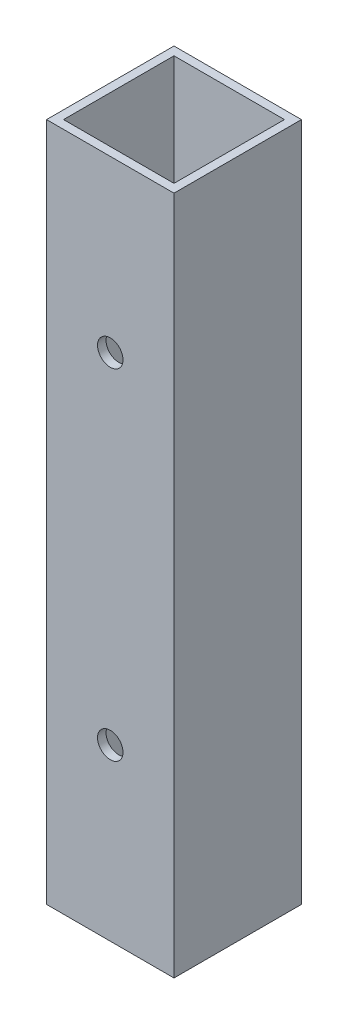
ISO-10303-21;
HEADER;
FILE_DESCRIPTION(('STEP AP214'),'2;1');
FILE_NAME('part.step','',(''),(''),'','','');
FILE_SCHEMA(('AUTOMOTIVE_DESIGN { 1 0 10303 214 1 1 1 1 }'));
ENDSEC;
DATA;
#1=APPLICATION_CONTEXT('core data for automotive mechanical design processes');
#2=APPLICATION_PROTOCOL_DEFINITION('international standard','automotive_design',2000,#1);
#3=PRODUCT_CONTEXT('',#1,'mechanical');
#4=PRODUCT('Part','Part','',(#3));
#5=PRODUCT_RELATED_PRODUCT_CATEGORY('part','',(#4));
#6=PRODUCT_DEFINITION_FORMATION('','',#4);
#7=PRODUCT_DEFINITION_CONTEXT('part definition',#1,'design');
#8=PRODUCT_DEFINITION('design','',#6,#7);
#9=PRODUCT_DEFINITION_SHAPE('','',#8);
#10=(LENGTH_UNIT() NAMED_UNIT(*) SI_UNIT(.MILLI.,.METRE.));
#11=(NAMED_UNIT(*) PLANE_ANGLE_UNIT() SI_UNIT($,.RADIAN.));
#12=(NAMED_UNIT(*) SI_UNIT($,.STERADIAN.) SOLID_ANGLE_UNIT());
#13=UNCERTAINTY_MEASURE_WITH_UNIT(LENGTH_MEASURE(1.E-05),#10,'distance_accuracy_value','');
#14=(GEOMETRIC_REPRESENTATION_CONTEXT(3) GLOBAL_UNCERTAINTY_ASSIGNED_CONTEXT((#13)) GLOBAL_UNIT_ASSIGNED_CONTEXT((#10,
#11,#12)) REPRESENTATION_CONTEXT('',''));
#15=CARTESIAN_POINT('',(0.,0.,0.));
#16=DIRECTION('',(0.,0.,1.));
#17=DIRECTION('',(1.,0.,0.));
#18=AXIS2_PLACEMENT_3D('',#15,#16,#17);
#19=CARTESIAN_POINT('',(0.,80.,0.));
#20=DIRECTION('',(0.,-1.,0.));
#21=DIRECTION('',(0.,0.,-1.));
#22=AXIS2_PLACEMENT_3D('',#19,#20,#21);
#23=PLANE('',#22);
#24=DIRECTION('',(0.,0.,-1.));
#25=VECTOR('',#24,1.);
#26=CARTESIAN_POINT('',(7.5,80.,7.5));
#27=LINE('',#26,#25);
#28=CARTESIAN_POINT('',(7.5,80.,7.5));
#29=VERTEX_POINT('',#28);
#30=CARTESIAN_POINT('',(7.5,80.,-7.5));
#31=VERTEX_POINT('',#30);
#32=EDGE_CURVE('E140',#29,#31,#27,.T.);
#33=ORIENTED_EDGE('',*,*,#32,.T.);
#34=DIRECTION('',(-1.,0.,0.));
#35=VECTOR('',#34,1.);
#36=CARTESIAN_POINT('',(-7.5,80.,-7.5));
#37=LINE('',#36,#35);
#38=CARTESIAN_POINT('',(-7.5,80.,-7.5));
#39=VERTEX_POINT('',#38);
#40=EDGE_CURVE('E143',#31,#39,#37,.T.);
#41=ORIENTED_EDGE('',*,*,#40,.T.);
#42=DIRECTION('',(0.,0.,1.));
#43=VECTOR('',#42,1.);
#44=CARTESIAN_POINT('',(-7.5,80.,7.5));
#45=LINE('',#44,#43);
#46=CARTESIAN_POINT('',(-7.5,80.,7.5));
#47=VERTEX_POINT('',#46);
#48=EDGE_CURVE('E146',#39,#47,#45,.T.);
#49=ORIENTED_EDGE('',*,*,#48,.T.);
#50=DIRECTION('',(1.,0.,0.));
#51=VECTOR('',#50,1.);
#52=CARTESIAN_POINT('',(-7.5,80.,7.5));
#53=LINE('',#52,#51);
#54=EDGE_CURVE('E148',#47,#29,#53,.T.);
#55=ORIENTED_EDGE('',*,*,#54,.T.);
#56=EDGE_LOOP('',(#33,#41,#49,#55));
#57=FACE_BOUND('',#56,.T.);
#58=DIRECTION('',(0.,0.,1.));
#59=VECTOR('',#58,1.);
#60=CARTESIAN_POINT('',(-6.5,80.,6.5));
#61=LINE('',#60,#59);
#62=CARTESIAN_POINT('',(-6.5,80.,-6.5));
#63=VERTEX_POINT('',#62);
#64=CARTESIAN_POINT('',(-6.5,80.,6.5));
#65=VERTEX_POINT('',#64);
#66=EDGE_CURVE('E102',#63,#65,#61,.T.);
#67=ORIENTED_EDGE('',*,*,#66,.F.);
#68=DIRECTION('',(-1.,0.,0.));
#69=VECTOR('',#68,1.);
#70=CARTESIAN_POINT('',(-6.5,80.,-6.5));
#71=LINE('',#70,#69);
#72=CARTESIAN_POINT('',(6.5,80.,-6.5));
#73=VERTEX_POINT('',#72);
#74=EDGE_CURVE('E124',#73,#63,#71,.T.);
#75=ORIENTED_EDGE('',*,*,#74,.F.);
#76=DIRECTION('',(0.,0.,-1.));
#77=VECTOR('',#76,1.);
#78=CARTESIAN_POINT('',(6.5,80.,6.5));
#79=LINE('',#78,#77);
#80=CARTESIAN_POINT('',(6.5,80.,6.5));
#81=VERTEX_POINT('',#80);
#82=EDGE_CURVE('E122',#81,#73,#79,.T.);
#83=ORIENTED_EDGE('',*,*,#82,.F.);
#84=DIRECTION('',(1.,0.,0.));
#85=VECTOR('',#84,1.);
#86=CARTESIAN_POINT('',(-6.5,80.,6.5));
#87=LINE('',#86,#85);
#88=EDGE_CURVE('E110',#65,#81,#87,.T.);
#89=ORIENTED_EDGE('',*,*,#88,.F.);
#90=EDGE_LOOP('',(#67,#75,#83,#89));
#91=FACE_BOUND('',#90,.T.);
#92=ADVANCED_FACE('F35',(#57,#91),#23,.F.);
#93=CARTESIAN_POINT('',(0.,0.,0.));
#94=DIRECTION('',(0.,-1.,0.));
#95=DIRECTION('',(0.,0.,-1.));
#96=AXIS2_PLACEMENT_3D('',#93,#94,#95);
#97=PLANE('',#96);
#98=DIRECTION('',(0.,0.,-1.));
#99=VECTOR('',#98,1.);
#100=CARTESIAN_POINT('',(7.5,0.,7.5));
#101=LINE('',#100,#99);
#102=CARTESIAN_POINT('',(7.5,0.,7.5));
#103=VERTEX_POINT('',#102);
#104=CARTESIAN_POINT('',(7.5,0.,-7.5));
#105=VERTEX_POINT('',#104);
#106=EDGE_CURVE('E118',#103,#105,#101,.T.);
#107=ORIENTED_EDGE('',*,*,#106,.F.);
#108=DIRECTION('',(1.,0.,0.));
#109=VECTOR('',#108,1.);
#110=CARTESIAN_POINT('',(-7.5,0.,7.5));
#111=LINE('',#110,#109);
#112=CARTESIAN_POINT('',(-7.5,0.,7.5));
#113=VERTEX_POINT('',#112);
#114=EDGE_CURVE('E144',#113,#103,#111,.T.);
#115=ORIENTED_EDGE('',*,*,#114,.F.);
#116=DIRECTION('',(0.,0.,1.));
#117=VECTOR('',#116,1.);
#118=CARTESIAN_POINT('',(-7.5,0.,7.5));
#119=LINE('',#118,#117);
#120=CARTESIAN_POINT('',(-7.5,0.,-7.5));
#121=VERTEX_POINT('',#120);
#122=EDGE_CURVE('E155',#121,#113,#119,.T.);
#123=ORIENTED_EDGE('',*,*,#122,.F.);
#124=DIRECTION('',(-1.,0.,0.));
#125=VECTOR('',#124,1.);
#126=CARTESIAN_POINT('',(-7.5,0.,-7.5));
#127=LINE('',#126,#125);
#128=EDGE_CURVE('E153',#105,#121,#127,.T.);
#129=ORIENTED_EDGE('',*,*,#128,.F.);
#130=EDGE_LOOP('',(#107,#115,#123,#129));
#131=FACE_BOUND('',#130,.T.);
#132=DIRECTION('',(-1.,0.,0.));
#133=VECTOR('',#132,1.);
#134=CARTESIAN_POINT('',(-6.5,0.,-6.5));
#135=LINE('',#134,#133);
#136=CARTESIAN_POINT('',(6.5,0.,-6.5));
#137=VERTEX_POINT('',#136);
#138=CARTESIAN_POINT('',(-6.5,0.,-6.5));
#139=VERTEX_POINT('',#138);
#140=EDGE_CURVE('E111',#137,#139,#135,.T.);
#141=ORIENTED_EDGE('',*,*,#140,.T.);
#142=DIRECTION('',(0.,0.,1.));
#143=VECTOR('',#142,1.);
#144=CARTESIAN_POINT('',(-6.5,0.,6.5));
#145=LINE('',#144,#143);
#146=CARTESIAN_POINT('',(-6.5,0.,6.5));
#147=VERTEX_POINT('',#146);
#148=EDGE_CURVE('E60',#139,#147,#145,.T.);
#149=ORIENTED_EDGE('',*,*,#148,.T.);
#150=DIRECTION('',(1.,0.,0.));
#151=VECTOR('',#150,1.);
#152=CARTESIAN_POINT('',(-6.5,0.,6.5));
#153=LINE('',#152,#151);
#154=CARTESIAN_POINT('',(6.5,0.,6.5));
#155=VERTEX_POINT('',#154);
#156=EDGE_CURVE('E117',#147,#155,#153,.T.);
#157=ORIENTED_EDGE('',*,*,#156,.T.);
#158=DIRECTION('',(0.,0.,-1.));
#159=VECTOR('',#158,1.);
#160=CARTESIAN_POINT('',(6.5,0.,6.5));
#161=LINE('',#160,#159);
#162=EDGE_CURVE('E132',#155,#137,#161,.T.);
#163=ORIENTED_EDGE('',*,*,#162,.T.);
#164=EDGE_LOOP('',(#141,#149,#157,#163));
#165=FACE_BOUND('',#164,.T.);
#166=ADVANCED_FACE('F202',(#131,#165),#97,.T.);
#167=CARTESIAN_POINT('',(7.5,80.,7.5));
#168=DIRECTION('',(-1.,0.,0.));
#169=DIRECTION('',(0.,0.,1.));
#170=AXIS2_PLACEMENT_3D('',#167,#168,#169);
#171=PLANE('',#170);
#172=ORIENTED_EDGE('',*,*,#106,.T.);
#173=DIRECTION('',(0.,-1.,0.));
#174=VECTOR('',#173,1.);
#175=CARTESIAN_POINT('',(7.5,80.,-7.5));
#176=LINE('',#175,#174);
#177=EDGE_CURVE('E11',#31,#105,#176,.T.);
#178=ORIENTED_EDGE('',*,*,#177,.F.);
#179=ORIENTED_EDGE('',*,*,#32,.F.);
#180=DIRECTION('',(0.,-1.,0.));
#181=VECTOR('',#180,1.);
#182=CARTESIAN_POINT('',(7.5,80.,7.5));
#183=LINE('',#182,#181);
#184=EDGE_CURVE('E150',#29,#103,#183,.T.);
#185=ORIENTED_EDGE('',*,*,#184,.T.);
#186=EDGE_LOOP('',(#172,#178,#179,#185));
#187=FACE_BOUND('',#186,.T.);
#188=ADVANCED_FACE('F37',(#187),#171,.F.);
#189=CARTESIAN_POINT('',(-7.5,80.,-7.5));
#190=DIRECTION('',(0.,0.,1.));
#191=DIRECTION('',(1.,0.,0.));
#192=AXIS2_PLACEMENT_3D('',#189,#190,#191);
#193=PLANE('',#192);
#194=CARTESIAN_POINT('',(0.,20.,-7.5));
#195=DIRECTION('',(0.,0.,1.));
#196=DIRECTION('',(1.,0.,0.));
#197=AXIS2_PLACEMENT_3D('',#194,#195,#196);
#198=CIRCLE('',#197,1.5);
#199=CARTESIAN_POINT('',(1.5,20.,-7.5));
#200=VERTEX_POINT('',#199);
#201=EDGE_CURVE('E184',#200,#200,#198,.T.);
#202=ORIENTED_EDGE('',*,*,#201,.T.);
#203=EDGE_LOOP('',(#202));
#204=FACE_BOUND('',#203,.T.);
#205=CARTESIAN_POINT('',(0.,60.,-7.5));
#206=DIRECTION('',(0.,0.,1.));
#207=DIRECTION('',(1.,0.,0.));
#208=AXIS2_PLACEMENT_3D('',#205,#206,#207);
#209=CIRCLE('',#208,1.5);
#210=CARTESIAN_POINT('',(1.5,60.,-7.5));
#211=VERTEX_POINT('',#210);
#212=EDGE_CURVE('E166',#211,#211,#209,.T.);
#213=ORIENTED_EDGE('',*,*,#212,.T.);
#214=EDGE_LOOP('',(#213));
#215=FACE_BOUND('',#214,.T.);
#216=ORIENTED_EDGE('',*,*,#128,.T.);
#217=DIRECTION('',(0.,-1.,0.));
#218=VECTOR('',#217,1.);
#219=CARTESIAN_POINT('',(-7.5,80.,-7.5));
#220=LINE('',#219,#218);
#221=EDGE_CURVE('E44',#39,#121,#220,.T.);
#222=ORIENTED_EDGE('',*,*,#221,.F.);
#223=ORIENTED_EDGE('',*,*,#40,.F.);
#224=ORIENTED_EDGE('',*,*,#177,.T.);
#225=EDGE_LOOP('',(#216,#222,#223,#224));
#226=FACE_BOUND('',#225,.T.);
#227=ADVANCED_FACE('F227',(#204,#215,#226),#193,.F.);
#228=CARTESIAN_POINT('',(-7.5,80.,7.5));
#229=DIRECTION('',(1.,0.,0.));
#230=DIRECTION('',(0.,0.,-1.));
#231=AXIS2_PLACEMENT_3D('',#228,#229,#230);
#232=PLANE('',#231);
#233=ORIENTED_EDGE('',*,*,#122,.T.);
#234=DIRECTION('',(0.,-1.,0.));
#235=VECTOR('',#234,1.);
#236=CARTESIAN_POINT('',(-7.5,80.,7.5));
#237=LINE('',#236,#235);
#238=EDGE_CURVE('E160',#47,#113,#237,.T.);
#239=ORIENTED_EDGE('',*,*,#238,.F.);
#240=ORIENTED_EDGE('',*,*,#48,.F.);
#241=ORIENTED_EDGE('',*,*,#221,.T.);
#242=EDGE_LOOP('',(#233,#239,#240,#241));
#243=FACE_BOUND('',#242,.T.);
#244=ADVANCED_FACE('F224',(#243),#232,.F.);
#245=CARTESIAN_POINT('',(-7.5,80.,7.5));
#246=DIRECTION('',(0.,0.,-1.));
#247=DIRECTION('',(-1.,0.,0.));
#248=AXIS2_PLACEMENT_3D('',#245,#246,#247);
#249=PLANE('',#248);
#250=CARTESIAN_POINT('',(0.,20.,7.5));
#251=DIRECTION('',(0.,0.,1.));
#252=DIRECTION('',(1.,0.,0.));
#253=AXIS2_PLACEMENT_3D('',#250,#251,#252);
#254=CIRCLE('',#253,1.5);
#255=CARTESIAN_POINT('',(1.5,20.,7.5));
#256=VERTEX_POINT('',#255);
#257=EDGE_CURVE('E181',#256,#256,#254,.T.);
#258=ORIENTED_EDGE('',*,*,#257,.F.);
#259=EDGE_LOOP('',(#258));
#260=FACE_BOUND('',#259,.T.);
#261=CARTESIAN_POINT('',(0.,60.,7.5));
#262=DIRECTION('',(0.,0.,1.));
#263=DIRECTION('',(1.,0.,0.));
#264=AXIS2_PLACEMENT_3D('',#261,#262,#263);
#265=CIRCLE('',#264,1.5);
#266=CARTESIAN_POINT('',(1.5,60.,7.5));
#267=VERTEX_POINT('',#266);
#268=EDGE_CURVE('E171',#267,#267,#265,.T.);
#269=ORIENTED_EDGE('',*,*,#268,.F.);
#270=EDGE_LOOP('',(#269));
#271=FACE_BOUND('',#270,.T.);
#272=ORIENTED_EDGE('',*,*,#114,.T.);
#273=ORIENTED_EDGE('',*,*,#184,.F.);
#274=ORIENTED_EDGE('',*,*,#54,.F.);
#275=ORIENTED_EDGE('',*,*,#238,.T.);
#276=EDGE_LOOP('',(#272,#273,#274,#275));
#277=FACE_BOUND('',#276,.T.);
#278=ADVANCED_FACE('F221',(#260,#271,#277),#249,.F.);
#279=CARTESIAN_POINT('',(-6.5,80.,6.5));
#280=DIRECTION('',(1.,0.,0.));
#281=DIRECTION('',(0.,0.,-1.));
#282=AXIS2_PLACEMENT_3D('',#279,#280,#281);
#283=PLANE('',#282);
#284=ORIENTED_EDGE('',*,*,#148,.F.);
#285=DIRECTION('',(0.,-1.,0.));
#286=VECTOR('',#285,1.);
#287=CARTESIAN_POINT('',(-6.5,80.,-6.5));
#288=LINE('',#287,#286);
#289=EDGE_CURVE('E106',#63,#139,#288,.T.);
#290=ORIENTED_EDGE('',*,*,#289,.F.);
#291=ORIENTED_EDGE('',*,*,#66,.T.);
#292=DIRECTION('',(0.,-1.,0.));
#293=VECTOR('',#292,1.);
#294=CARTESIAN_POINT('',(-6.5,80.,6.5));
#295=LINE('',#294,#293);
#296=EDGE_CURVE('E105',#65,#147,#295,.T.);
#297=ORIENTED_EDGE('',*,*,#296,.T.);
#298=EDGE_LOOP('',(#284,#290,#291,#297));
#299=FACE_BOUND('',#298,.T.);
#300=ADVANCED_FACE('F104',(#299),#283,.T.);
#301=CARTESIAN_POINT('',(-6.5,80.,6.5));
#302=DIRECTION('',(0.,0.,-1.));
#303=DIRECTION('',(-1.,0.,0.));
#304=AXIS2_PLACEMENT_3D('',#301,#302,#303);
#305=PLANE('',#304);
#306=CARTESIAN_POINT('',(0.,20.,6.5));
#307=DIRECTION('',(0.,0.,-1.));
#308=DIRECTION('',(-1.,0.,0.));
#309=AXIS2_PLACEMENT_3D('',#306,#307,#308);
#310=CIRCLE('',#309,1.5);
#311=CARTESIAN_POINT('',(-1.5,20.,6.5));
#312=VERTEX_POINT('',#311);
#313=EDGE_CURVE('E176',#312,#312,#310,.T.);
#314=ORIENTED_EDGE('',*,*,#313,.F.);
#315=EDGE_LOOP('',(#314));
#316=FACE_BOUND('',#315,.T.);
#317=CARTESIAN_POINT('',(0.,60.,6.5));
#318=DIRECTION('',(0.,0.,-1.));
#319=DIRECTION('',(-1.,0.,0.));
#320=AXIS2_PLACEMENT_3D('',#317,#318,#319);
#321=CIRCLE('',#320,1.5);
#322=CARTESIAN_POINT('',(-1.5,60.,6.5));
#323=VERTEX_POINT('',#322);
#324=EDGE_CURVE('E130',#323,#323,#321,.T.);
#325=ORIENTED_EDGE('',*,*,#324,.F.);
#326=EDGE_LOOP('',(#325));
#327=FACE_BOUND('',#326,.T.);
#328=ORIENTED_EDGE('',*,*,#156,.F.);
#329=ORIENTED_EDGE('',*,*,#296,.F.);
#330=ORIENTED_EDGE('',*,*,#88,.T.);
#331=DIRECTION('',(0.,-1.,0.));
#332=VECTOR('',#331,1.);
#333=CARTESIAN_POINT('',(6.5,80.,6.5));
#334=LINE('',#333,#332);
#335=EDGE_CURVE('E119',#81,#155,#334,.T.);
#336=ORIENTED_EDGE('',*,*,#335,.T.);
#337=EDGE_LOOP('',(#328,#329,#330,#336));
#338=FACE_BOUND('',#337,.T.);
#339=ADVANCED_FACE('F114',(#316,#327,#338),#305,.T.);
#340=CARTESIAN_POINT('',(6.5,80.,6.5));
#341=DIRECTION('',(-1.,0.,0.));
#342=DIRECTION('',(0.,0.,1.));
#343=AXIS2_PLACEMENT_3D('',#340,#341,#342);
#344=PLANE('',#343);
#345=ORIENTED_EDGE('',*,*,#162,.F.);
#346=ORIENTED_EDGE('',*,*,#335,.F.);
#347=ORIENTED_EDGE('',*,*,#82,.T.);
#348=DIRECTION('',(0.,-1.,0.));
#349=VECTOR('',#348,1.);
#350=CARTESIAN_POINT('',(6.5,80.,-6.5));
#351=LINE('',#350,#349);
#352=EDGE_CURVE('E52',#73,#137,#351,.T.);
#353=ORIENTED_EDGE('',*,*,#352,.T.);
#354=EDGE_LOOP('',(#345,#346,#347,#353));
#355=FACE_BOUND('',#354,.T.);
#356=ADVANCED_FACE('F198',(#355),#344,.T.);
#357=CARTESIAN_POINT('',(-6.5,80.,-6.5));
#358=DIRECTION('',(0.,0.,1.));
#359=DIRECTION('',(1.,0.,0.));
#360=AXIS2_PLACEMENT_3D('',#357,#358,#359);
#361=PLANE('',#360);
#362=CARTESIAN_POINT('',(0.,20.,-6.5));
#363=DIRECTION('',(0.,0.,1.));
#364=DIRECTION('',(1.,0.,0.));
#365=AXIS2_PLACEMENT_3D('',#362,#363,#364);
#366=CIRCLE('',#365,1.5);
#367=CARTESIAN_POINT('',(1.5,20.,-6.5));
#368=VERTEX_POINT('',#367);
#369=EDGE_CURVE('E39',#368,#368,#366,.T.);
#370=ORIENTED_EDGE('',*,*,#369,.F.);
#371=EDGE_LOOP('',(#370));
#372=FACE_BOUND('',#371,.T.);
#373=CARTESIAN_POINT('',(0.,60.,-6.5));
#374=DIRECTION('',(0.,0.,1.));
#375=DIRECTION('',(1.,0.,0.));
#376=AXIS2_PLACEMENT_3D('',#373,#374,#375);
#377=CIRCLE('',#376,1.5);
#378=CARTESIAN_POINT('',(1.5,60.,-6.5));
#379=VERTEX_POINT('',#378);
#380=EDGE_CURVE('E164',#379,#379,#377,.T.);
#381=ORIENTED_EDGE('',*,*,#380,.F.);
#382=EDGE_LOOP('',(#381));
#383=FACE_BOUND('',#382,.T.);
#384=ORIENTED_EDGE('',*,*,#140,.F.);
#385=ORIENTED_EDGE('',*,*,#352,.F.);
#386=ORIENTED_EDGE('',*,*,#74,.T.);
#387=ORIENTED_EDGE('',*,*,#289,.T.);
#388=EDGE_LOOP('',(#384,#385,#386,#387));
#389=FACE_BOUND('',#388,.T.);
#390=ADVANCED_FACE('F194',(#372,#383,#389),#361,.T.);
#391=CARTESIAN_POINT('',(0.,60.,-7.5));
#392=DIRECTION('',(0.,0.,1.));
#393=DIRECTION('',(1.,0.,0.));
#394=AXIS2_PLACEMENT_3D('',#391,#392,#393);
#395=CYLINDRICAL_SURFACE('',#394,1.5);
#396=ORIENTED_EDGE('',*,*,#380,.T.);
#397=EDGE_LOOP('',(#396));
#398=FACE_BOUND('',#397,.T.);
#399=ORIENTED_EDGE('',*,*,#212,.F.);
#400=EDGE_LOOP('',(#399));
#401=FACE_BOUND('',#400,.T.);
#402=ADVANCED_FACE('F197',(#398,#401),#395,.F.);
#403=ORIENTED_EDGE('',*,*,#324,.T.);
#404=EDGE_LOOP('',(#403));
#405=FACE_BOUND('',#404,.T.);
#406=ORIENTED_EDGE('',*,*,#268,.T.);
#407=EDGE_LOOP('',(#406));
#408=FACE_BOUND('',#407,.T.);
#409=ADVANCED_FACE('F302',(#405,#408),#395,.F.);
#410=CARTESIAN_POINT('',(0.,20.,-7.5));
#411=DIRECTION('',(0.,0.,1.));
#412=DIRECTION('',(1.,0.,0.));
#413=AXIS2_PLACEMENT_3D('',#410,#411,#412);
#414=CYLINDRICAL_SURFACE('',#413,1.5);
#415=ORIENTED_EDGE('',*,*,#369,.T.);
#416=EDGE_LOOP('',(#415));
#417=FACE_BOUND('',#416,.T.);
#418=ORIENTED_EDGE('',*,*,#201,.F.);
#419=EDGE_LOOP('',(#418));
#420=FACE_BOUND('',#419,.T.);
#421=ADVANCED_FACE('F191',(#417,#420),#414,.F.);
#422=ORIENTED_EDGE('',*,*,#313,.T.);
#423=EDGE_LOOP('',(#422));
#424=FACE_BOUND('',#423,.T.);
#425=ORIENTED_EDGE('',*,*,#257,.T.);
#426=EDGE_LOOP('',(#425));
#427=FACE_BOUND('',#426,.T.);
#428=ADVANCED_FACE('F317',(#424,#427),#414,.F.);
#429=CLOSED_SHELL('',(#92,#166,#188,#227,#244,#278,#300,#339,#356,#390,#402,#409,#421,#428));
#430=MANIFOLD_SOLID_BREP('B2',#429);
#431=ADVANCED_BREP_SHAPE_REPRESENTATION('',(#18,#430),#14);
#432=SHAPE_DEFINITION_REPRESENTATION(#9,#431);
ENDSEC;
END-ISO-10303-21;
